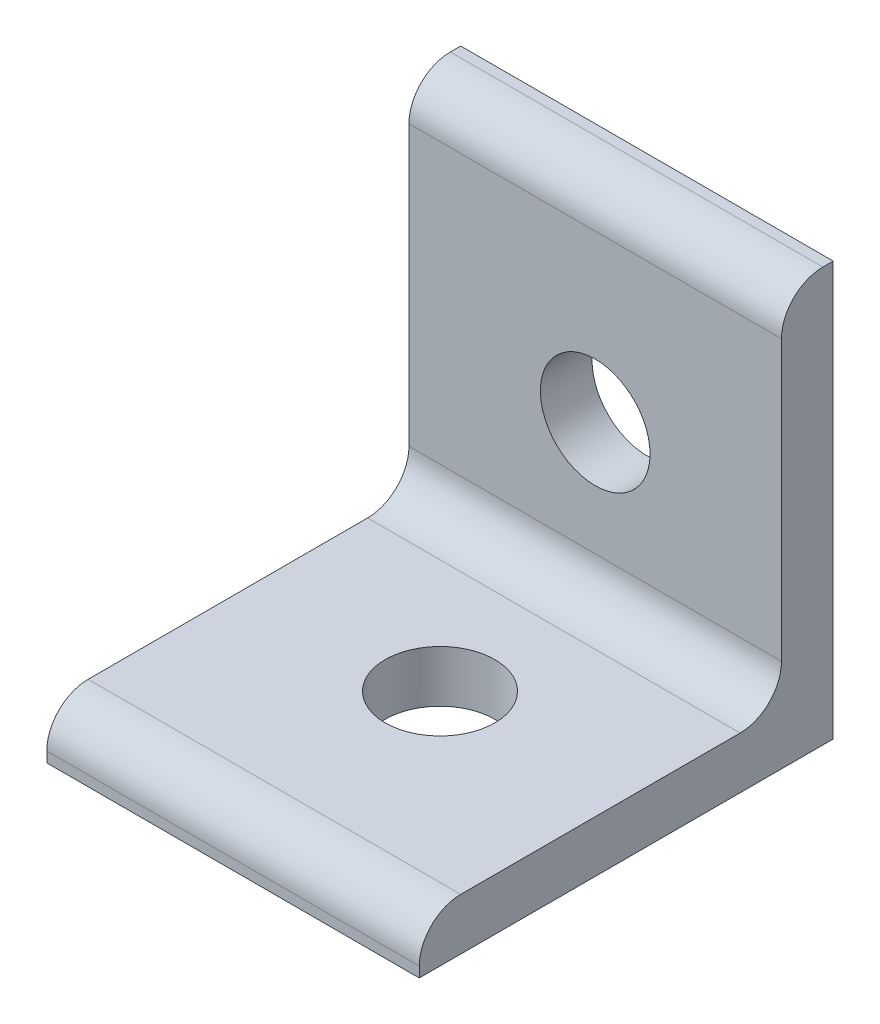
ISO-10303-21;
HEADER;
FILE_DESCRIPTION(('STEP AP214'),'2;1');
FILE_NAME('part.step','',(''),(''),'','','');
FILE_SCHEMA(('AUTOMOTIVE_DESIGN { 1 0 10303 214 1 1 1 1 }'));
ENDSEC;
DATA;
#1=APPLICATION_CONTEXT('core data for automotive mechanical design processes');
#2=APPLICATION_PROTOCOL_DEFINITION('international standard','automotive_design',2000,#1);
#3=PRODUCT_CONTEXT('',#1,'mechanical');
#4=PRODUCT('Part','Part','',(#3));
#5=PRODUCT_RELATED_PRODUCT_CATEGORY('part','',(#4));
#6=PRODUCT_DEFINITION_FORMATION('','',#4);
#7=PRODUCT_DEFINITION_CONTEXT('part definition',#1,'design');
#8=PRODUCT_DEFINITION('design','',#6,#7);
#9=PRODUCT_DEFINITION_SHAPE('','',#8);
#10=(LENGTH_UNIT() NAMED_UNIT(*) SI_UNIT(.MILLI.,.METRE.));
#11=(NAMED_UNIT(*) PLANE_ANGLE_UNIT() SI_UNIT($,.RADIAN.));
#12=(NAMED_UNIT(*) SI_UNIT($,.STERADIAN.) SOLID_ANGLE_UNIT());
#13=UNCERTAINTY_MEASURE_WITH_UNIT(LENGTH_MEASURE(1.E-05),#10,'distance_accuracy_value','');
#14=(GEOMETRIC_REPRESENTATION_CONTEXT(3) GLOBAL_UNCERTAINTY_ASSIGNED_CONTEXT((#13)) GLOBAL_UNIT_ASSIGNED_CONTEXT((#10,
#11,#12)) REPRESENTATION_CONTEXT('',''));
#15=CARTESIAN_POINT('',(0.,0.,0.));
#16=DIRECTION('',(0.,0.,1.));
#17=DIRECTION('',(1.,0.,0.));
#18=AXIS2_PLACEMENT_3D('',#15,#16,#17);
#19=CARTESIAN_POINT('',(-23.,0.,-41.6));
#20=DIRECTION('',(1.,0.,0.));
#21=DIRECTION('',(0.,1.,0.));
#22=AXIS2_PLACEMENT_3D('',#19,#20,#21);
#23=PLANE('',#22);
#24=DIRECTION('',(0.,-1.,0.));
#25=VECTOR('',#24,1.);
#26=CARTESIAN_POINT('',(-23.,0.,-24.1));
#27=LINE('',#26,#25);
#28=CARTESIAN_POINT('',(-23.,-40.175,-24.1));
#29=VERTEX_POINT('',#28);
#30=CARTESIAN_POINT('',(-23.,-40.675,-24.1));
#31=VERTEX_POINT('',#30);
#32=EDGE_CURVE('E109',#29,#31,#27,.T.);
#33=ORIENTED_EDGE('',*,*,#32,.F.);
#34=CARTESIAN_POINT('',(-23.,-40.175,-26.1));
#35=DIRECTION('',(1.,0.,0.));
#36=DIRECTION('',(0.,1.,0.));
#37=AXIS2_PLACEMENT_3D('',#34,#35,#36);
#38=CIRCLE('',#37,2.);
#39=CARTESIAN_POINT('',(-23.,-38.175,-26.1));
#40=VERTEX_POINT('',#39);
#41=EDGE_CURVE('E178',#29,#40,#38,.F.);
#42=ORIENTED_EDGE('',*,*,#41,.T.);
#43=DIRECTION('',(0.,0.,-1.));
#44=VECTOR('',#43,1.);
#45=CARTESIAN_POINT('',(-23.,-38.175,-24.1));
#46=LINE('',#45,#44);
#47=CARTESIAN_POINT('',(-23.,-38.175,-39.6));
#48=VERTEX_POINT('',#47);
#49=EDGE_CURVE('E141',#40,#48,#46,.T.);
#50=ORIENTED_EDGE('',*,*,#49,.T.);
#51=CARTESIAN_POINT('',(-23.,-36.175,-39.6));
#52=DIRECTION('',(1.,0.,0.));
#53=DIRECTION('',(0.,1.,0.));
#54=AXIS2_PLACEMENT_3D('',#51,#52,#53);
#55=CIRCLE('',#54,2.);
#56=CARTESIAN_POINT('',(-23.,-36.175,-41.6));
#57=VERTEX_POINT('',#56);
#58=EDGE_CURVE('E49',#48,#57,#55,.T.);
#59=ORIENTED_EDGE('',*,*,#58,.T.);
#60=DIRECTION('',(0.,-1.,0.));
#61=VECTOR('',#60,1.);
#62=CARTESIAN_POINT('',(-23.,0.,-41.6));
#63=LINE('',#62,#61);
#64=CARTESIAN_POINT('',(-23.,-22.675,-41.6));
#65=VERTEX_POINT('',#64);
#66=EDGE_CURVE('E147',#65,#57,#63,.T.);
#67=ORIENTED_EDGE('',*,*,#66,.F.);
#68=CARTESIAN_POINT('',(-23.,-22.675,-43.6));
#69=DIRECTION('',(1.,0.,0.));
#70=DIRECTION('',(0.,1.,0.));
#71=AXIS2_PLACEMENT_3D('',#68,#69,#70);
#72=CIRCLE('',#71,2.);
#73=CARTESIAN_POINT('',(-23.,-20.675,-43.6));
#74=VERTEX_POINT('',#73);
#75=EDGE_CURVE('E56',#65,#74,#72,.F.);
#76=ORIENTED_EDGE('',*,*,#75,.T.);
#77=DIRECTION('',(0.,0.,-1.));
#78=VECTOR('',#77,1.);
#79=CARTESIAN_POINT('',(-23.,-20.675,-41.6));
#80=LINE('',#79,#78);
#81=CARTESIAN_POINT('',(-23.,-20.675,-44.1));
#82=VERTEX_POINT('',#81);
#83=EDGE_CURVE('E153',#74,#82,#80,.T.);
#84=ORIENTED_EDGE('',*,*,#83,.T.);
#85=DIRECTION('',(0.,-1.,0.));
#86=VECTOR('',#85,1.);
#87=CARTESIAN_POINT('',(-23.,0.,-44.1));
#88=LINE('',#87,#86);
#89=CARTESIAN_POINT('',(-23.,-40.675,-44.1));
#90=VERTEX_POINT('',#89);
#91=EDGE_CURVE('E123',#82,#90,#88,.T.);
#92=ORIENTED_EDGE('',*,*,#91,.T.);
#93=DIRECTION('',(0.,0.,-1.));
#94=VECTOR('',#93,1.);
#95=CARTESIAN_POINT('',(-23.,-40.675,-41.6));
#96=LINE('',#95,#94);
#97=EDGE_CURVE('E121',#31,#90,#96,.T.);
#98=ORIENTED_EDGE('',*,*,#97,.F.);
#99=EDGE_LOOP('',(#33,#42,#50,#59,#67,#76,#84,#92,#98));
#100=FACE_BOUND('',#99,.T.);
#101=ADVANCED_FACE('F41',(#100),#23,.F.);
#102=CARTESIAN_POINT('',(0.,-40.675,-41.6));
#103=DIRECTION('',(0.,-1.,0.));
#104=DIRECTION('',(0.,0.,-1.));
#105=AXIS2_PLACEMENT_3D('',#102,#103,#104);
#106=PLANE('',#105);
#107=CARTESIAN_POINT('',(-14.,-40.675,-34.1));
#108=DIRECTION('',(0.,-1.,0.));
#109=DIRECTION('',(0.,0.,-1.));
#110=AXIS2_PLACEMENT_3D('',#107,#108,#109);
#111=CIRCLE('',#110,2.65);
#112=CARTESIAN_POINT('',(-14.,-40.675,-36.75));
#113=VERTEX_POINT('',#112);
#114=EDGE_CURVE('E118',#113,#113,#111,.T.);
#115=ORIENTED_EDGE('',*,*,#114,.F.);
#116=EDGE_LOOP('',(#115));
#117=FACE_BOUND('',#116,.T.);
#118=DIRECTION('',(-1.,0.,0.));
#119=VECTOR('',#118,1.);
#120=CARTESIAN_POINT('',(0.,-40.675,-44.1));
#121=LINE('',#120,#119);
#122=CARTESIAN_POINT('',(-5.,-40.675,-44.1));
#123=VERTEX_POINT('',#122);
#124=EDGE_CURVE('E157',#123,#90,#121,.T.);
#125=ORIENTED_EDGE('',*,*,#124,.F.);
#126=DIRECTION('',(0.,0.,-1.));
#127=VECTOR('',#126,1.);
#128=CARTESIAN_POINT('',(-5.,-40.675,-41.6));
#129=LINE('',#128,#127);
#130=CARTESIAN_POINT('',(-5.,-40.675,-24.1));
#131=VERTEX_POINT('',#130);
#132=EDGE_CURVE('E128',#131,#123,#129,.T.);
#133=ORIENTED_EDGE('',*,*,#132,.F.);
#134=DIRECTION('',(-1.,0.,0.));
#135=VECTOR('',#134,1.);
#136=CARTESIAN_POINT('',(0.,-40.675,-24.1));
#137=LINE('',#136,#135);
#138=EDGE_CURVE('E114',#131,#31,#137,.T.);
#139=ORIENTED_EDGE('',*,*,#138,.T.);
#140=ORIENTED_EDGE('',*,*,#97,.T.);
#141=EDGE_LOOP('',(#125,#133,#139,#140));
#142=FACE_BOUND('',#141,.T.);
#143=ADVANCED_FACE('F131',(#117,#142),#106,.T.);
#144=CARTESIAN_POINT('',(-5.,0.,-41.6));
#145=DIRECTION('',(1.,0.,0.));
#146=DIRECTION('',(0.,1.,0.));
#147=AXIS2_PLACEMENT_3D('',#144,#145,#146);
#148=PLANE('',#147);
#149=DIRECTION('',(0.,0.,-1.));
#150=VECTOR('',#149,1.);
#151=CARTESIAN_POINT('',(-5.,-38.175,-24.1));
#152=LINE('',#151,#150);
#153=CARTESIAN_POINT('',(-5.,-38.175,-26.1));
#154=VERTEX_POINT('',#153);
#155=CARTESIAN_POINT('',(-5.,-38.175,-39.6));
#156=VERTEX_POINT('',#155);
#157=EDGE_CURVE('E135',#154,#156,#152,.T.);
#158=ORIENTED_EDGE('',*,*,#157,.F.);
#159=CARTESIAN_POINT('',(-5.,-40.175,-26.1));
#160=DIRECTION('',(1.,0.,0.));
#161=DIRECTION('',(0.,1.,0.));
#162=AXIS2_PLACEMENT_3D('',#159,#160,#161);
#163=CIRCLE('',#162,2.);
#164=CARTESIAN_POINT('',(-5.,-40.175,-24.1));
#165=VERTEX_POINT('',#164);
#166=EDGE_CURVE('E174',#154,#165,#163,.T.);
#167=ORIENTED_EDGE('',*,*,#166,.T.);
#168=DIRECTION('',(0.,-1.,0.));
#169=VECTOR('',#168,1.);
#170=CARTESIAN_POINT('',(-5.,0.,-24.1));
#171=LINE('',#170,#169);
#172=EDGE_CURVE('E133',#165,#131,#171,.T.);
#173=ORIENTED_EDGE('',*,*,#172,.T.);
#174=ORIENTED_EDGE('',*,*,#132,.T.);
#175=DIRECTION('',(0.,-1.,0.));
#176=VECTOR('',#175,1.);
#177=CARTESIAN_POINT('',(-5.,0.,-44.1));
#178=LINE('',#177,#176);
#179=CARTESIAN_POINT('',(-5.,-20.675,-44.1));
#180=VERTEX_POINT('',#179);
#181=EDGE_CURVE('E159',#180,#123,#178,.T.);
#182=ORIENTED_EDGE('',*,*,#181,.F.);
#183=DIRECTION('',(0.,0.,-1.));
#184=VECTOR('',#183,1.);
#185=CARTESIAN_POINT('',(-5.,-20.675,-41.6));
#186=LINE('',#185,#184);
#187=CARTESIAN_POINT('',(-5.,-20.675,-43.6));
#188=VERTEX_POINT('',#187);
#189=EDGE_CURVE('E164',#188,#180,#186,.T.);
#190=ORIENTED_EDGE('',*,*,#189,.F.);
#191=CARTESIAN_POINT('',(-5.,-22.675,-43.6));
#192=DIRECTION('',(1.,0.,0.));
#193=DIRECTION('',(0.,1.,0.));
#194=AXIS2_PLACEMENT_3D('',#191,#192,#193);
#195=CIRCLE('',#194,2.);
#196=CARTESIAN_POINT('',(-5.,-22.675,-41.6));
#197=VERTEX_POINT('',#196);
#198=EDGE_CURVE('E172',#188,#197,#195,.T.);
#199=ORIENTED_EDGE('',*,*,#198,.T.);
#200=DIRECTION('',(0.,-1.,0.));
#201=VECTOR('',#200,1.);
#202=CARTESIAN_POINT('',(-5.,0.,-41.6));
#203=LINE('',#202,#201);
#204=CARTESIAN_POINT('',(-5.,-36.175,-41.6));
#205=VERTEX_POINT('',#204);
#206=EDGE_CURVE('E150',#197,#205,#203,.T.);
#207=ORIENTED_EDGE('',*,*,#206,.T.);
#208=CARTESIAN_POINT('',(-5.,-36.175,-39.6));
#209=DIRECTION('',(1.,0.,0.));
#210=DIRECTION('',(0.,1.,0.));
#211=AXIS2_PLACEMENT_3D('',#208,#209,#210);
#212=CIRCLE('',#211,2.);
#213=EDGE_CURVE('E11',#205,#156,#212,.F.);
#214=ORIENTED_EDGE('',*,*,#213,.T.);
#215=EDGE_LOOP('',(#158,#167,#173,#174,#182,#190,#199,#207,#214));
#216=FACE_BOUND('',#215,.T.);
#217=ADVANCED_FACE('F196',(#216),#148,.T.);
#218=CARTESIAN_POINT('',(-14.,-30.675,-41.6));
#219=DIRECTION('',(0.,0.,-1.));
#220=DIRECTION('',(-1.,0.,0.));
#221=AXIS2_PLACEMENT_3D('',#218,#219,#220);
#222=CYLINDRICAL_SURFACE('',#221,2.65);
#223=CARTESIAN_POINT('',(-14.,-30.675,-41.6));
#224=DIRECTION('',(0.,0.,1.));
#225=DIRECTION('',(1.,0.,0.));
#226=AXIS2_PLACEMENT_3D('',#223,#224,#225);
#227=CIRCLE('',#226,2.65);
#228=CARTESIAN_POINT('',(-11.35,-30.675,-41.6));
#229=VERTEX_POINT('',#228);
#230=EDGE_CURVE('E144',#229,#229,#227,.T.);
#231=ORIENTED_EDGE('',*,*,#230,.T.);
#232=EDGE_LOOP('',(#231));
#233=FACE_BOUND('',#232,.T.);
#234=CARTESIAN_POINT('',(-14.,-30.675,-44.1));
#235=DIRECTION('',(0.,0.,1.));
#236=DIRECTION('',(1.,0.,0.));
#237=AXIS2_PLACEMENT_3D('',#234,#235,#236);
#238=CIRCLE('',#237,2.65);
#239=CARTESIAN_POINT('',(-11.35,-30.675,-44.1));
#240=VERTEX_POINT('',#239);
#241=EDGE_CURVE('E143',#240,#240,#238,.T.);
#242=ORIENTED_EDGE('',*,*,#241,.F.);
#243=EDGE_LOOP('',(#242));
#244=FACE_BOUND('',#243,.T.);
#245=ADVANCED_FACE('F237',(#233,#244),#222,.F.);
#246=CARTESIAN_POINT('',(0.,-20.675,-41.6));
#247=DIRECTION('',(0.,-1.,0.));
#248=DIRECTION('',(1.,0.,0.));
#249=AXIS2_PLACEMENT_3D('',#246,#247,#248);
#250=PLANE('',#249);
#251=ORIENTED_EDGE('',*,*,#83,.F.);
#252=DIRECTION('',(-1.,0.,0.));
#253=VECTOR('',#252,1.);
#254=CARTESIAN_POINT('',(-5.,-20.675,-43.6));
#255=LINE('',#254,#253);
#256=EDGE_CURVE('E185',#74,#188,#255,.F.);
#257=ORIENTED_EDGE('',*,*,#256,.T.);
#258=ORIENTED_EDGE('',*,*,#189,.T.);
#259=DIRECTION('',(-1.,0.,0.));
#260=VECTOR('',#259,1.);
#261=CARTESIAN_POINT('',(0.,-20.675,-44.1));
#262=LINE('',#261,#260);
#263=EDGE_CURVE('E148',#180,#82,#262,.T.);
#264=ORIENTED_EDGE('',*,*,#263,.T.);
#265=EDGE_LOOP('',(#251,#257,#258,#264));
#266=FACE_BOUND('',#265,.T.);
#267=ADVANCED_FACE('F189',(#266),#250,.F.);
#268=CARTESIAN_POINT('',(0.,0.,-41.6));
#269=DIRECTION('',(0.,0.,1.));
#270=DIRECTION('',(1.,0.,0.));
#271=AXIS2_PLACEMENT_3D('',#268,#269,#270);
#272=PLANE('',#271);
#273=ORIENTED_EDGE('',*,*,#66,.T.);
#274=DIRECTION('',(-1.,0.,0.));
#275=VECTOR('',#274,1.);
#276=CARTESIAN_POINT('',(-5.,-36.175,-41.6));
#277=LINE('',#276,#275);
#278=EDGE_CURVE('E183',#57,#205,#277,.F.);
#279=ORIENTED_EDGE('',*,*,#278,.T.);
#280=ORIENTED_EDGE('',*,*,#206,.F.);
#281=DIRECTION('',(-1.,0.,0.));
#282=VECTOR('',#281,1.);
#283=CARTESIAN_POINT('',(-23.,-22.675,-41.6));
#284=LINE('',#283,#282);
#285=EDGE_CURVE('E180',#197,#65,#284,.T.);
#286=ORIENTED_EDGE('',*,*,#285,.T.);
#287=EDGE_LOOP('',(#273,#279,#280,#286));
#288=FACE_BOUND('',#287,.T.);
#289=ORIENTED_EDGE('',*,*,#230,.F.);
#290=EDGE_LOOP('',(#289));
#291=FACE_BOUND('',#290,.T.);
#292=ADVANCED_FACE('F200',(#288,#291),#272,.T.);
#293=CARTESIAN_POINT('',(0.,0.,-44.1));
#294=DIRECTION('',(0.,0.,1.));
#295=DIRECTION('',(1.,0.,0.));
#296=AXIS2_PLACEMENT_3D('',#293,#294,#295);
#297=PLANE('',#296);
#298=ORIENTED_EDGE('',*,*,#241,.T.);
#299=EDGE_LOOP('',(#298));
#300=FACE_BOUND('',#299,.T.);
#301=ORIENTED_EDGE('',*,*,#181,.T.);
#302=ORIENTED_EDGE('',*,*,#124,.T.);
#303=ORIENTED_EDGE('',*,*,#91,.F.);
#304=ORIENTED_EDGE('',*,*,#263,.F.);
#305=EDGE_LOOP('',(#301,#302,#303,#304));
#306=FACE_BOUND('',#305,.T.);
#307=ADVANCED_FACE('F214',(#300,#306),#297,.F.);
#308=CARTESIAN_POINT('',(0.,-38.175,-24.1));
#309=DIRECTION('',(0.,1.,0.));
#310=DIRECTION('',(0.,0.,1.));
#311=AXIS2_PLACEMENT_3D('',#308,#309,#310);
#312=PLANE('',#311);
#313=CARTESIAN_POINT('',(-14.,-38.175,-34.1));
#314=DIRECTION('',(0.,1.,0.));
#315=DIRECTION('',(0.,0.,1.));
#316=AXIS2_PLACEMENT_3D('',#313,#314,#315);
#317=CIRCLE('',#316,2.65);
#318=CARTESIAN_POINT('',(-14.,-38.175,-31.45));
#319=VERTEX_POINT('',#318);
#320=EDGE_CURVE('E362',#319,#319,#317,.T.);
#321=ORIENTED_EDGE('',*,*,#320,.F.);
#322=EDGE_LOOP('',(#321));
#323=FACE_BOUND('',#322,.T.);
#324=ORIENTED_EDGE('',*,*,#49,.F.);
#325=DIRECTION('',(1.,0.,0.));
#326=VECTOR('',#325,1.);
#327=CARTESIAN_POINT('',(0.,-38.175,-26.1));
#328=LINE('',#327,#326);
#329=EDGE_CURVE('E169',#40,#154,#328,.T.);
#330=ORIENTED_EDGE('',*,*,#329,.T.);
#331=ORIENTED_EDGE('',*,*,#157,.T.);
#332=DIRECTION('',(-1.,0.,0.));
#333=VECTOR('',#332,1.);
#334=CARTESIAN_POINT('',(-23.,-38.175,-39.6));
#335=LINE('',#334,#333);
#336=EDGE_CURVE('E127',#156,#48,#335,.T.);
#337=ORIENTED_EDGE('',*,*,#336,.T.);
#338=EDGE_LOOP('',(#324,#330,#331,#337));
#339=FACE_BOUND('',#338,.T.);
#340=ADVANCED_FACE('F209',(#323,#339),#312,.T.);
#341=CARTESIAN_POINT('',(0.,0.,-24.1));
#342=DIRECTION('',(0.,0.,1.));
#343=DIRECTION('',(1.,0.,0.));
#344=AXIS2_PLACEMENT_3D('',#341,#342,#343);
#345=PLANE('',#344);
#346=ORIENTED_EDGE('',*,*,#172,.F.);
#347=DIRECTION('',(1.,0.,0.));
#348=VECTOR('',#347,1.);
#349=CARTESIAN_POINT('',(0.,-40.175,-24.1));
#350=LINE('',#349,#348);
#351=EDGE_CURVE('E116',#165,#29,#350,.F.);
#352=ORIENTED_EDGE('',*,*,#351,.T.);
#353=ORIENTED_EDGE('',*,*,#32,.T.);
#354=ORIENTED_EDGE('',*,*,#138,.F.);
#355=EDGE_LOOP('',(#346,#352,#353,#354));
#356=FACE_BOUND('',#355,.T.);
#357=ADVANCED_FACE('F112',(#356),#345,.T.);
#358=CARTESIAN_POINT('',(0.,-40.175,-26.1));
#359=DIRECTION('',(1.,0.,0.));
#360=DIRECTION('',(0.,0.,-1.));
#361=AXIS2_PLACEMENT_3D('',#358,#359,#360);
#362=CYLINDRICAL_SURFACE('',#361,2.);
#363=ORIENTED_EDGE('',*,*,#41,.F.);
#364=ORIENTED_EDGE('',*,*,#351,.F.);
#365=ORIENTED_EDGE('',*,*,#166,.F.);
#366=ORIENTED_EDGE('',*,*,#329,.F.);
#367=EDGE_LOOP('',(#363,#364,#365,#366));
#368=FACE_BOUND('',#367,.T.);
#369=ADVANCED_FACE('F212',(#368),#362,.T.);
#370=CARTESIAN_POINT('',(0.,-36.175,-39.6));
#371=DIRECTION('',(1.,0.,0.));
#372=DIRECTION('',(0.,0.,-1.));
#373=AXIS2_PLACEMENT_3D('',#370,#371,#372);
#374=CYLINDRICAL_SURFACE('',#373,2.);
#375=ORIENTED_EDGE('',*,*,#213,.F.);
#376=ORIENTED_EDGE('',*,*,#278,.F.);
#377=ORIENTED_EDGE('',*,*,#58,.F.);
#378=ORIENTED_EDGE('',*,*,#336,.F.);
#379=EDGE_LOOP('',(#375,#376,#377,#378));
#380=FACE_BOUND('',#379,.T.);
#381=ADVANCED_FACE('F206',(#380),#374,.F.);
#382=CARTESIAN_POINT('',(0.,-22.675,-43.6));
#383=DIRECTION('',(1.,0.,0.));
#384=DIRECTION('',(0.,1.,0.));
#385=AXIS2_PLACEMENT_3D('',#382,#383,#384);
#386=CYLINDRICAL_SURFACE('',#385,2.);
#387=ORIENTED_EDGE('',*,*,#198,.F.);
#388=ORIENTED_EDGE('',*,*,#256,.F.);
#389=ORIENTED_EDGE('',*,*,#75,.F.);
#390=ORIENTED_EDGE('',*,*,#285,.F.);
#391=EDGE_LOOP('',(#387,#388,#389,#390));
#392=FACE_BOUND('',#391,.T.);
#393=ADVANCED_FACE('F43',(#392),#386,.T.);
#394=CARTESIAN_POINT('',(-14.,-48.175,-34.1));
#395=DIRECTION('',(0.,1.,0.));
#396=DIRECTION('',(0.,0.,1.));
#397=AXIS2_PLACEMENT_3D('',#394,#395,#396);
#398=CYLINDRICAL_SURFACE('',#397,2.65);
#399=ORIENTED_EDGE('',*,*,#114,.T.);
#400=EDGE_LOOP('',(#399));
#401=FACE_BOUND('',#400,.T.);
#402=ORIENTED_EDGE('',*,*,#320,.T.);
#403=EDGE_LOOP('',(#402));
#404=FACE_BOUND('',#403,.T.);
#405=ADVANCED_FACE('F245',(#401,#404),#398,.F.);
#406=CLOSED_SHELL('',(#101,#143,#217,#245,#267,#292,#307,#340,#357,#369,#381,#393,#405));
#407=MANIFOLD_SOLID_BREP('B2',#406);
#408=ADVANCED_BREP_SHAPE_REPRESENTATION('',(#18,#407),#14);
#409=SHAPE_DEFINITION_REPRESENTATION(#9,#408);
ENDSEC;
END-ISO-10303-21;
